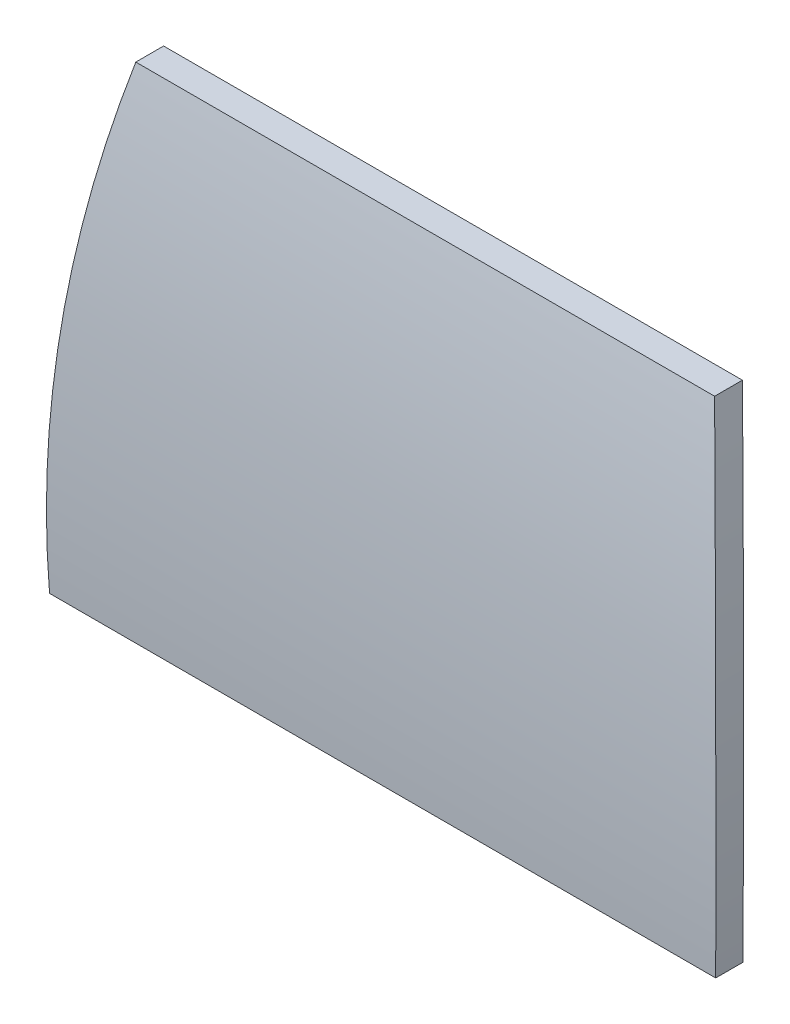
ISO-10303-21;
HEADER;
FILE_DESCRIPTION(('STEP AP214'),'2;1');
FILE_NAME('part.step','',(''),(''),'','','');
FILE_SCHEMA(('AUTOMOTIVE_DESIGN { 1 0 10303 214 1 1 1 1 }'));
ENDSEC;
DATA;
#1=APPLICATION_CONTEXT('core data for automotive mechanical design processes');
#2=APPLICATION_PROTOCOL_DEFINITION('international standard','automotive_design',2000,#1);
#3=PRODUCT_CONTEXT('',#1,'mechanical');
#4=PRODUCT('Part','Part','',(#3));
#5=PRODUCT_RELATED_PRODUCT_CATEGORY('part','',(#4));
#6=PRODUCT_DEFINITION_FORMATION('','',#4);
#7=PRODUCT_DEFINITION_CONTEXT('part definition',#1,'design');
#8=PRODUCT_DEFINITION('design','',#6,#7);
#9=PRODUCT_DEFINITION_SHAPE('','',#8);
#10=(LENGTH_UNIT() NAMED_UNIT(*) SI_UNIT(.MILLI.,.METRE.));
#11=(NAMED_UNIT(*) PLANE_ANGLE_UNIT() SI_UNIT($,.RADIAN.));
#12=(NAMED_UNIT(*) SI_UNIT($,.STERADIAN.) SOLID_ANGLE_UNIT());
#13=UNCERTAINTY_MEASURE_WITH_UNIT(LENGTH_MEASURE(1.E-05),#10,'distance_accuracy_value','');
#14=(GEOMETRIC_REPRESENTATION_CONTEXT(3) GLOBAL_UNCERTAINTY_ASSIGNED_CONTEXT((#13)) GLOBAL_UNIT_ASSIGNED_CONTEXT((#10,
#11,#12)) REPRESENTATION_CONTEXT('',''));
#15=CARTESIAN_POINT('',(0.,0.,0.));
#16=DIRECTION('',(0.,0.,1.));
#17=DIRECTION('',(1.,0.,0.));
#18=AXIS2_PLACEMENT_3D('',#15,#16,#17);
#19=CARTESIAN_POINT('',(124.179493225304,1295.4,254.));
#20=DIRECTION('',(0.,1.,0.));
#21=DIRECTION('',(0.,0.,1.));
#22=AXIS2_PLACEMENT_3D('',#19,#20,#21);
#23=PLANE('',#22);
#24=DIRECTION('',(0.,0.,-1.));
#25=VECTOR('',#24,1.);
#26=CARTESIAN_POINT('',(124.179493225304,1295.4,254.));
#27=LINE('',#26,#25);
#28=CARTESIAN_POINT('',(124.179493225304,1295.4,-118.0703125));
#29=VERTEX_POINT('',#28);
#30=CARTESIAN_POINT('',(124.179493225304,1295.4,-196.186778864413));
#31=VERTEX_POINT('',#30);
#32=EDGE_CURVE('E138',#29,#31,#27,.T.);
#33=ORIENTED_EDGE('',*,*,#32,.F.);
#34=DIRECTION('',(1.,0.,0.));
#35=VECTOR('',#34,1.);
#36=CARTESIAN_POINT('',(-1778.,1295.4,-118.0703125));
#37=LINE('',#36,#35);
#38=CARTESIAN_POINT('',(1749.7794932253,1295.4,-118.0703125));
#39=VERTEX_POINT('',#38);
#40=EDGE_CURVE('E171',#29,#39,#37,.T.);
#41=ORIENTED_EDGE('',*,*,#40,.T.);
#42=DIRECTION('',(0.,0.,-1.));
#43=VECTOR('',#42,1.);
#44=CARTESIAN_POINT('',(1749.7794932253,1295.4,254.));
#45=LINE('',#44,#43);
#46=CARTESIAN_POINT('',(1749.7794932253,1295.4,-196.186778864413));
#47=VERTEX_POINT('',#46);
#48=EDGE_CURVE('E144',#39,#47,#45,.T.);
#49=ORIENTED_EDGE('',*,*,#48,.T.);
#50=DIRECTION('',(1.,0.,0.));
#51=VECTOR('',#50,1.);
#52=CARTESIAN_POINT('',(-1778.,1295.4,-196.186778864413));
#53=LINE('',#52,#51);
#54=EDGE_CURVE('E130',#31,#47,#53,.T.);
#55=ORIENTED_EDGE('',*,*,#54,.F.);
#56=EDGE_LOOP('',(#33,#41,#49,#55));
#57=FACE_BOUND('',#56,.T.);
#58=ADVANCED_FACE('F80',(#57),#23,.T.);
#59=CARTESIAN_POINT('',(4720.11491641945,201.172900249094,254.));
#60=DIRECTION('',(0.,0.,-1.));
#61=DIRECTION('',(-1.,0.,0.));
#62=AXIS2_PLACEMENT_3D('',#59,#60,#61);
#63=CYLINDRICAL_SURFACE('',#62,4724.4);
#64=CARTESIAN_POINT('',(124.179493225305,1295.4,-118.070312500048));
#65=CARTESIAN_POINT('',(121.069812315793,1282.3388308182,-115.086184242106));
#66=CARTESIAN_POINT('',(118.013210171241,1269.25347187329,-112.153150319882));
#67=CARTESIAN_POINT('',(112.007016473262,1243.03556245005,-106.390139647571));
#68=CARTESIAN_POINT('',(109.057425106246,1229.90301188956,-103.560163077006));
#69=CARTESIAN_POINT('',(100.370482184698,1190.43651149152,-95.2261561297446));
#70=CARTESIAN_POINT('',(94.794940919211,1164.03362522618,-89.8780284697998));
#71=CARTESIAN_POINT('',(84.082125290662,1111.05518275444,-79.6043886545862));
#72=CARTESIAN_POINT('',(78.9448865213368,1084.47961271295,-74.6789108217436));
#73=CARTESIAN_POINT('',(69.1156646072195,1031.17044565624,-65.2576254129734));
#74=CARTESIAN_POINT('',(64.4236794882457,1004.43684934225,-60.7618159319658));
#75=CARTESIAN_POINT('',(55.5311674203843,951.065635511124,-52.2444524571049));
#76=CARTESIAN_POINT('',(51.3266052434973,924.429312192683,-48.2190019056469));
#77=CARTESIAN_POINT('',(43.3662119694127,871.027872784341,-40.6016632767679));
#78=CARTESIAN_POINT('',(39.6103811421866,844.262756616963,-37.0097754601925));
#79=CARTESIAN_POINT('',(32.5525268274494,790.618451556057,-30.2646900322868));
#80=CARTESIAN_POINT('',(29.250489524817,763.739266160902,-27.1114790660057));
#81=CARTESIAN_POINT('',(23.1045222474866,709.880441414233,-21.2481018497201));
#82=CARTESIAN_POINT('',(20.2605921858587,682.90080208178,-18.5379355156441));
#83=CARTESIAN_POINT('',(15.034398905281,628.852532188738,-13.5642647929107));
#84=CARTESIAN_POINT('',(12.6521849333601,601.783892448082,-11.3008080502067));
#85=CARTESIAN_POINT('',(9.42790456035769,561.128545223557,-8.24342126149054));
#86=CARTESIAN_POINT('',(8.41131480346189,547.567982118877,-7.28058916455031));
#87=CARTESIAN_POINT('',(6.494779502591,520.430778899539,-5.46782797014183));
#88=CARTESIAN_POINT('',(5.59483643880174,506.854138449229,-4.61790127330107));
#89=CARTESIAN_POINT('',(3.07050541796342,466.103497638401,-2.23801088260977));
#90=CARTESIAN_POINT('',(1.62158063979844,438.908336751173,-0.877903706807279));
#91=CARTESIAN_POINT('',(-0.806253954059922,384.478104333366,1.38722454496585));
#92=CARTESIAN_POINT('',(-1.78516388116343,357.243032812248,2.29224572880794));
#93=CARTESIAN_POINT('',(-2.90338720072489,316.249407973363,3.31051636731869));
#94=CARTESIAN_POINT('',(-3.21838321291887,302.499509826263,3.59389150932875));
#95=CARTESIAN_POINT('',(-3.72829671271741,274.995874371903,4.04435609155903));
#96=CARTESIAN_POINT('',(-3.92321673335173,261.242137151754,4.21144798480991));
#97=CARTESIAN_POINT('',(-4.32775498047067,219.977581652507,4.53818654794127));
#98=CARTESIAN_POINT('',(-4.35715650427478,192.46323215755,4.52330075662259));
#99=CARTESIAN_POINT('',(-3.93531715015976,137.44180841599,4.02803344353027));
#100=CARTESIAN_POINT('',(-3.48406573630233,109.934734342085,3.54764171786227));
#101=CARTESIAN_POINT('',(-2.44725885589918,68.6927403475285,2.47847894224159));
#102=CARTESIAN_POINT('',(-2.04166329678651,54.9483952367969,2.06399048616887));
#103=CARTESIAN_POINT('',(-1.11065453060016,27.4677309929707,1.11898014885806));
#104=CARTESIAN_POINT('',(-0.585241121893294,13.7314118734215,0.588458072355076));
#105=CARTESIAN_POINT('',(-1.17138151591573E-13,1.31505676272261E-13,4.85969091697876E-11));
#106=B_SPLINE_CURVE_WITH_KNOTS('',3,(#64,#65,#66,#67,#68,#69,#70,#71,#72,#73,#74,#75,#76,#77,
#78,#79,#80,#81,#82,#83,#84,#85,#86,#87,#88,#89,#90,#91,#92,#93,#94,#95,#96,#97,#98,#99,#100,
#101,#102,#103,#104,#105),.UNSPECIFIED.,.F.,.F.,(4,2,2,2,2,2,2,2,2,2,2,2,2,2,2,2,2,2,2,2,4),(0.,
41.2611926904615,82.5224572533026,165.044709344237,247.573656549024,330.102237816858,
411.889652190688,493.677115770261,575.462088890868,657.247046492053,739.040722551297,
779.937858143282,820.835863162935,902.630542467087,984.425202383001,1025.69358427508,
1066.96109557164,1149.49555580337,1232.03182523215,1273.30066082635,1314.56956586954),.UNSPECIFIED.);
#107=CARTESIAN_POINT('',(0.,0.,0.));
#108=VERTEX_POINT('',#107);
#109=EDGE_CURVE('E102',#29,#108,#106,.T.);
#110=ORIENTED_EDGE('',*,*,#109,.F.);
#111=ORIENTED_EDGE('',*,*,#32,.T.);
#112=CARTESIAN_POINT('',(124.179493225305,1295.4,-196.186778864414));
#113=CARTESIAN_POINT('',(121.068860263091,1282.33483159595,-193.229171358011));
#114=CARTESIAN_POINT('',(118.011432248345,1269.24585309259,-190.321309967949));
#115=CARTESIAN_POINT('',(112.003813571932,1243.02143908946,-184.605925870522));
#116=CARTESIAN_POINT('',(109.053623089499,1229.88600351208,-181.798403330864));
#117=CARTESIAN_POINT('',(100.365184710962,1190.41191359675,-173.527647522483));
#118=CARTESIAN_POINT('',(94.7890481254546,1164.00538472007,-168.216205375737));
#119=CARTESIAN_POINT('',(84.075653018519,1111.02227275364,-158.00480066179));
#120=CARTESIAN_POINT('',(78.9384287516425,1084.4456765648,-153.104870211189));
#121=CARTESIAN_POINT('',(69.1096429741278,1031.13669791746,-143.723350278077));
#122=CARTESIAN_POINT('',(64.4180795702413,1004.40431612127,-139.241759018385));
#123=CARTESIAN_POINT('',(55.5256719239439,951.031584319315,-130.7403363622));
#124=CARTESIAN_POINT('',(51.3208880259919,924.392480392203,-126.716802941197));
#125=CARTESIAN_POINT('',(43.3603449017789,870.986990445372,-119.092064888095));
#126=CARTESIAN_POINT('',(39.6045859359102,844.220604351852,-115.490860500908));
#127=CARTESIAN_POINT('',(32.5470460066447,790.57489568469,-108.715784370945));
#128=CARTESIAN_POINT('',(29.2452518417907,763.695576418622,-105.541900201602));
#129=CARTESIAN_POINT('',(23.0998519362544,709.837301048887,-99.6257239090019));
#130=CARTESIAN_POINT('',(20.2562461123694,682.858344963315,-96.8834317073717));
#131=CARTESIAN_POINT('',(15.030719833587,628.811990825891,-91.8339793694016));
#132=CARTESIAN_POINT('',(12.6488471107589,601.744583924147,-89.5268642205403));
#133=CARTESIAN_POINT('',(9.42504741972631,561.091126879574,-86.3952907783293));
#134=CARTESIAN_POINT('',(8.4086127698785,547.531201913459,-85.4062799213352));
#135=CARTESIAN_POINT('',(6.49237531760525,520.395253574842,-83.5382565705519));
#136=CARTESIAN_POINT('',(5.59257493485812,506.819229874253,-82.6592463588338));
#137=CARTESIAN_POINT('',(3.06864969197426,466.070336191109,-80.1877423206085));
#138=CARTESIAN_POINT('',(1.61996552936711,438.876199790911,-78.7607408897118));
#139=CARTESIAN_POINT('',(-0.80744512423764,384.447321882289,-76.3501710825335));
#140=CARTESIAN_POINT('',(-1.78617173114655,357.212580383881,-75.3666025968827));
#141=CARTESIAN_POINT('',(-2.90405491041519,316.221648023439,-74.2214832436201));
#142=CARTESIAN_POINT('',(-3.21891147810693,302.47452665056,-73.8941200542088));
#143=CARTESIAN_POINT('',(-3.7285978969424,274.976113185498,-73.3526708067673));
#144=CARTESIAN_POINT('',(-3.92343021784314,261.224821184962,-73.1385824178773));
#145=CARTESIAN_POINT('',(-4.32777075941755,219.967044944319,-72.6663466588179));
#146=CARTESIAN_POINT('',(-4.35712759153224,192.456475968312,-72.5782235411757));
#147=CARTESIAN_POINT('',(-3.93528582885693,137.440708643657,-72.8555090866083));
#148=CARTESIAN_POINT('',(-3.48407671141678,109.9355104258,-73.2209276806293));
#149=CARTESIAN_POINT('',(-2.44730964066491,68.6945906981424,-74.1087257309944));
#150=CARTESIAN_POINT('',(-2.04172348662251,54.9503154945403,-74.4612744772306));
#151=CARTESIAN_POINT('',(-1.11070809764531,27.4691685210984,-75.279449128832));
#152=CARTESIAN_POINT('',(-0.585278662965239,13.7322967636364,-75.7450752226658));
#153=CARTESIAN_POINT('',(-4.24092768705555E-13,4.28265447391173E-13,-76.2671652196317));
#154=B_SPLINE_CURVE_WITH_KNOTS('',3,(#112,#113,#114,#115,#116,#117,#118,#119,#120,#121,#122,
#123,#124,#125,#126,#127,#128,#129,#130,#131,#132,#133,#134,#135,#136,#137,#138,#139,#140,#141,
#142,#143,#144,#145,#146,#147,#148,#149,#150,#151,#152,#153),.UNSPECIFIED.,.F.,.F.,(4,2,2,2,2,2,
2,2,2,2,2,2,2,2,2,2,2,2,2,2,4),(0.,41.256058258685,82.5121854691904,165.024151467941,
247.542551174238,330.060600311689,411.855594391405,493.650635904327,575.443298285157,
657.235945813194,739.037044225087,779.937883458418,820.839571079122,902.641607037728,
984.4436228205,1025.7066209493,1066.96876997482,1149.49251425976,1232.01806555233,
1273.28153150594,1314.54506623473),.UNSPECIFIED.);
#155=CARTESIAN_POINT('',(0.,0.,-76.2671652196312));
#156=VERTEX_POINT('',#155);
#157=EDGE_CURVE('E124',#31,#156,#154,.T.);
#158=ORIENTED_EDGE('',*,*,#157,.T.);
#159=DIRECTION('',(0.,0.,-1.));
#160=VECTOR('',#159,1.);
#161=CARTESIAN_POINT('',(0.,5.55111512312578E-13,254.));
#162=LINE('',#161,#160);
#163=EDGE_CURVE('E136',#108,#156,#162,.T.);
#164=ORIENTED_EDGE('',*,*,#163,.F.);
#165=EDGE_LOOP('',(#110,#111,#158,#164));
#166=FACE_BOUND('',#165,.T.);
#167=ADVANCED_FACE('F135',(#166),#63,.T.);
#168=CARTESIAN_POINT('',(0.,0.,254.));
#169=DIRECTION('',(0.,1.,0.));
#170=DIRECTION('',(0.,0.,1.));
#171=AXIS2_PLACEMENT_3D('',#168,#169,#170);
#172=PLANE('',#171);
#173=DIRECTION('',(1.,0.,0.));
#174=VECTOR('',#173,1.);
#175=CARTESIAN_POINT('',(-1778.,0.,0.));
#176=LINE('',#175,#174);
#177=CARTESIAN_POINT('',(1870.964,0.,0.));
#178=VERTEX_POINT('',#177);
#179=EDGE_CURVE('E98',#108,#178,#176,.T.);
#180=ORIENTED_EDGE('',*,*,#179,.F.);
#181=ORIENTED_EDGE('',*,*,#163,.T.);
#182=DIRECTION('',(1.,0.,0.));
#183=VECTOR('',#182,1.);
#184=CARTESIAN_POINT('',(-1778.,0.,-76.2671652196312));
#185=LINE('',#184,#183);
#186=CARTESIAN_POINT('',(1870.964,0.,-76.2671652196312));
#187=VERTEX_POINT('',#186);
#188=EDGE_CURVE('E120',#156,#187,#185,.T.);
#189=ORIENTED_EDGE('',*,*,#188,.T.);
#190=DIRECTION('',(0.,0.,-1.));
#191=VECTOR('',#190,1.);
#192=CARTESIAN_POINT('',(1870.964,0.,254.));
#193=LINE('',#192,#191);
#194=EDGE_CURVE('E141',#178,#187,#193,.T.);
#195=ORIENTED_EDGE('',*,*,#194,.F.);
#196=EDGE_LOOP('',(#180,#181,#189,#195));
#197=FACE_BOUND('',#196,.T.);
#198=ADVANCED_FACE('F140',(#197),#172,.F.);
#199=CARTESIAN_POINT('',(-2848.68393844922,211.845927721114,254.));
#200=DIRECTION('',(0.,0.,-1.));
#201=DIRECTION('',(-1.,0.,0.));
#202=AXIS2_PLACEMENT_3D('',#199,#200,#201);
#203=CYLINDRICAL_SURFACE('',#202,4724.4);
#204=ORIENTED_EDGE('',*,*,#48,.F.);
#205=CARTESIAN_POINT('',(1749.7794932253,1295.4,-118.070312500048));
#206=CARTESIAN_POINT('',(1752.85810908438,1282.33475906293,-115.085253943212));
#207=CARTESIAN_POINT('',(1755.88362116769,1269.2454388277,-112.151350292436));
#208=CARTESIAN_POINT('',(1761.82758620292,1243.01983181138,-106.386716163662));
#209=CARTESIAN_POINT('',(1764.74603896905,1229.88354494883,-103.555985864718));
#210=CARTESIAN_POINT('',(1773.33949552409,1190.40618087392,-95.2198843694875));
#211=CARTESIAN_POINT('',(1778.85261868934,1163.99651057817,-89.8705820963837));
#212=CARTESIAN_POINT('',(1789.44042465525,1111.00546234909,-79.5949963110039));
#213=CARTESIAN_POINT('',(1794.5150720693,1084.42407074293,-74.6687469408319));
#214=CARTESIAN_POINT('',(1804.21896788451,1031.10424000341,-65.2462737248424));
#215=CARTESIAN_POINT('',(1808.84821825408,1004.36580156466,-60.7500479785473));
#216=CARTESIAN_POINT('',(1817.61569948667,950.985991586951,-52.2321692880596));
#217=CARTESIAN_POINT('',(1821.75796732553,924.345905454949,-48.2066163641626));
#218=CARTESIAN_POINT('',(1829.59368366283,870.93795525266,-40.5893269195782));
#219=CARTESIAN_POINT('',(1833.287131893,844.170091106007,-36.9975906581943));
#220=CARTESIAN_POINT('',(1840.22016404233,790.521324686783,-30.2530127395787));
#221=CARTESIAN_POINT('',(1843.4597617497,763.640425873831,-27.1001577489253));
#222=CARTESIAN_POINT('',(1849.48082209697,709.779228599514,-21.2376463456619));
#223=CARTESIAN_POINT('',(1852.26228482352,682.798930156953,-18.5279898492159));
#224=CARTESIAN_POINT('',(1857.36353793883,628.750444566821,-13.5554437387382));
#225=CARTESIAN_POINT('',(1859.68327965523,601.682248458851,-11.292601225846));
#226=CARTESIAN_POINT('',(1862.81388368032,561.028376664006,-8.23617139467009));
#227=CARTESIAN_POINT('',(1863.7992532158,547.46844033334,-7.27366421816707));
#228=CARTESIAN_POINT('',(1865.65336195554,520.33276164355,-5.4615580196152));
#229=CARTESIAN_POINT('',(1866.52209868068,506.757018954636,-4.61196139756021));
#230=CARTESIAN_POINT('',(1868.95283962131,466.009475036694,-2.23305858419979));
#231=CARTESIAN_POINT('',(1870.33940827496,438.816920830771,-0.873606569941388));
#232=CARTESIAN_POINT('',(1872.64264280264,384.392990977742,1.39027211952501));
#233=CARTESIAN_POINT('',(1873.55930878151,357.1616153393,2.29469889626523));
#234=CARTESIAN_POINT('',(1874.58399801725,316.174344847968,3.31216263380261));
#235=CARTESIAN_POINT('',(1874.86764739968,302.426699933483,3.59528206814687));
#236=CARTESIAN_POINT('',(1875.31491045677,274.927847020845,4.04527120351362));
#237=CARTESIAN_POINT('',(1875.47852666362,261.176639103978,4.21214335684245));
#238=CARTESIAN_POINT('',(1875.78922331132,219.920083806896,4.53828714409945));
#239=CARTESIAN_POINT('',(1875.75615644275,192.411618378837,4.52309073582165));
#240=CARTESIAN_POINT('',(1875.20960376642,137.40307316672,4.02742977640882));
#241=CARTESIAN_POINT('',(1874.69610776405,109.902993572995,3.54695535214759));
#242=CARTESIAN_POINT('',(1873.56613148225,68.672298931584,2.47788067658529));
#243=CARTESIAN_POINT('',(1873.12951213787,54.9318556023691,2.06345697615265));
#244=CARTESIAN_POINT('',(1872.13652561549,27.4592616813093,1.1186536134809));
#245=CARTESIAN_POINT('',(1871.58015823733,13.7271111033642,0.588273757422278));
#246=CARTESIAN_POINT('',(1870.964,1.84083917052033E-12,4.91388023815528E-11));
#247=B_SPLINE_CURVE_WITH_KNOTS('',3,(#205,#206,#207,#208,#209,#210,#211,#212,#213,#214,#215,
#216,#217,#218,#219,#220,#221,#222,#223,#224,#225,#226,#227,#228,#229,#230,#231,#232,#233,#234,
#235,#236,#237,#238,#239,#240,#241,#242,#243,#244,#245,#246),.UNSPECIFIED.,.F.,.F.,(4,2,2,2,2,2,
2,2,2,2,2,2,2,2,2,2,2,2,2,2,4),(0.,41.2524331701597,82.5049379294498,165.009664608232,
247.521043511642,330.032057741409,411.801935881847,493.571862898033,575.339305162553,
657.106731959831,738.88277371862,779.771092315391,820.660279883397,902.437336411593,
984.214374692426,1025.47393819483,1066.73263127556,1149.24945773725,1231.76803523137,
1273.0280205705,1314.2880748758),.UNSPECIFIED.);
#248=EDGE_CURVE('E12',#39,#178,#247,.T.);
#249=ORIENTED_EDGE('',*,*,#248,.T.);
#250=ORIENTED_EDGE('',*,*,#194,.T.);
#251=CARTESIAN_POINT('',(1749.7794932253,1295.4,-196.186778864414));
#252=CARTESIAN_POINT('',(1752.859052612,1282.33075440478,-193.228248379154));
#253=CARTESIAN_POINT('',(1755.88538277876,1269.23780999223,-190.319523641546));
#254=CARTESIAN_POINT('',(1761.83075868174,1243.00569063036,-184.602527062847));
#255=CARTESIAN_POINT('',(1764.74980423931,1229.8665156041,-181.794255389033));
#256=CARTESIAN_POINT('',(1773.34473947349,1190.38155445018,-173.521416251457));
#257=CARTESIAN_POINT('',(1778.85844966696,1163.96823910492,-168.208803578352));
#258=CARTESIAN_POINT('',(1789.44682425119,1110.9725197148,-157.995454955193));
#259=CARTESIAN_POINT('',(1794.5214545839,1084.39010272461,-153.094750956464));
#260=CARTESIAN_POINT('',(1804.22491401353,1031.07046465456,-143.712034217513));
#261=CARTESIAN_POINT('',(1808.85374499823,1004.33324423073,-139.230019704327));
#262=CARTESIAN_POINT('',(1817.62111755045,950.951921036071,-130.728063479914));
#263=CARTESIAN_POINT('',(1821.76360041005,924.30905573803,-126.704416485718));
#264=CARTESIAN_POINT('',(1829.5994567048,870.897058989503,-119.079702720018));
#265=CARTESIAN_POINT('',(1833.29282988116,844.12792746627,-115.478636192012));
#266=CARTESIAN_POINT('',(1840.22554395253,790.477762995185,-108.704038888067));
#267=CARTESIAN_POINT('',(1843.46489802352,763.596733318025,-105.530495705184));
#268=CARTESIAN_POINT('',(1849.48539199879,709.736091216987,-99.6151552090619));
#269=CARTESIAN_POINT('',(1852.26653198601,682.756478810957,-96.8733578176636));
#270=CARTESIAN_POINT('',(1857.36712263572,628.70991218612,-91.8250012109061));
#271=CARTESIAN_POINT('',(1859.68652611113,601.642949327491,-89.5184864804156));
#272=CARTESIAN_POINT('',(1862.81665407727,560.990967680482,-86.3878513476026));
#273=CARTESIAN_POINT('',(1863.80187006796,547.431669371575,-85.3991595398229));
#274=CARTESIAN_POINT('',(1865.65568403585,520.297245104695,-83.531780307388));
#275=CARTESIAN_POINT('',(1866.52427959443,506.722118824347,-82.6530951642348));
#276=CARTESIAN_POINT('',(1868.95461904671,465.976320873426,-80.1825652501953));
#277=CARTESIAN_POINT('',(1870.34094961484,438.78479000304,-78.7562120914521));
#278=CARTESIAN_POINT('',(1872.6437636267,384.362211653849,-76.3468836453649));
#279=CARTESIAN_POINT('',(1873.56024718012,357.13116418427,-75.3639082545139));
#280=CARTESIAN_POINT('',(1874.5846025374,316.146584322109,-74.2195989949638));
#281=CARTESIAN_POINT('',(1874.86811881724,302.401716243312,-73.8924934015264));
#282=CARTESIAN_POINT('',(1875.31516670905,274.908085309448,-73.3515253130295));
#283=CARTESIAN_POINT('',(1875.47870078994,261.159322540347,-73.1376604877858));
#284=CARTESIAN_POINT('',(1875.78921516798,219.909546234984,-72.6660341490046));
#285=CARTESIAN_POINT('',(1875.75611219196,192.404861037538,-72.5782356436453));
#286=CARTESIAN_POINT('',(1875.20956992545,137.401971236835,-72.8559527833964));
#287=CARTESIAN_POINT('',(1874.69612043628,109.903766783576,-73.2214780535031));
#288=CARTESIAN_POINT('',(1873.56618637558,68.6741464712273,-74.1092324184715));
#289=CARTESIAN_POINT('',(1873.1295765902,54.9337732246646,-74.461732626837));
#290=CARTESIAN_POINT('',(1872.13658236996,27.4606974566816,-75.2797357137626));
#291=CARTESIAN_POINT('',(1871.58019773676,13.7279949480013,-75.7452387794468));
#292=CARTESIAN_POINT('',(1870.964,2.19084821801792E-12,-76.2671652196315));
#293=B_SPLINE_CURVE_WITH_KNOTS('',3,(#251,#252,#253,#254,#255,#256,#257,#258,#259,#260,#261,
#262,#263,#264,#265,#266,#267,#268,#269,#270,#271,#272,#273,#274,#275,#276,#277,#278,#279,#280,
#281,#282,#283,#284,#285,#286,#287,#288,#289,#290,#291,#292),.UNSPECIFIED.,.F.,.F.,(4,2,2,2,2,2,
2,2,2,2,2,2,2,2,2,2,2,2,2,2,4),(0.,41.2472944343529,82.4946575521488,164.989089878197,
247.489915316755,329.990391385084,411.767848309121,493.545352354421,575.320482663496,
657.095598168833,738.879066379122,779.771090656549,820.663962880655,902.448379588883,
984.232777204456,1025.48695570919,1066.74028528314,1149.24639320041,1231.75425292207,
1273.0088690093,1314.26355341149),.UNSPECIFIED.);
#294=EDGE_CURVE('E91',#47,#187,#293,.T.);
#295=ORIENTED_EDGE('',*,*,#294,.F.);
#296=EDGE_LOOP('',(#204,#249,#250,#295));
#297=FACE_BOUND('',#296,.T.);
#298=ADVANCED_FACE('F153',(#297),#203,.T.);
#299=CARTESIAN_POINT('',(-1778.,190.178521981645,-5078.48207620329));
#300=DIRECTION('',(1.,0.,0.));
#301=DIRECTION('',(0.,0.,-1.));
#302=AXIS2_PLACEMENT_3D('',#299,#300,#301);
#303=CYLINDRICAL_SURFACE('',#302,5005.82879110846);
#304=ORIENTED_EDGE('',*,*,#54,.T.);
#305=ORIENTED_EDGE('',*,*,#294,.T.);
#306=ORIENTED_EDGE('',*,*,#188,.F.);
#307=ORIENTED_EDGE('',*,*,#157,.F.);
#308=EDGE_LOOP('',(#304,#305,#306,#307));
#309=FACE_BOUND('',#308,.T.);
#310=ADVANCED_FACE('F123',(#309),#303,.F.);
#311=CARTESIAN_POINT('',(-1778.,208.861419048448,-4873.72130154307));
#312=DIRECTION('',(1.,0.,0.));
#313=DIRECTION('',(0.,0.,-1.));
#314=AXIS2_PLACEMENT_3D('',#311,#312,#313);
#315=CYLINDRICAL_SURFACE('',#314,4878.19458585674);
#316=ORIENTED_EDGE('',*,*,#109,.T.);
#317=ORIENTED_EDGE('',*,*,#179,.T.);
#318=ORIENTED_EDGE('',*,*,#248,.F.);
#319=ORIENTED_EDGE('',*,*,#40,.F.);
#320=EDGE_LOOP('',(#316,#317,#318,#319));
#321=FACE_BOUND('',#320,.T.);
#322=ADVANCED_FACE('F159',(#321),#315,.T.);
#323=CLOSED_SHELL('',(#58,#167,#198,#298,#310,#322));
#324=MANIFOLD_SOLID_BREP('B2',#323);
#325=ADVANCED_BREP_SHAPE_REPRESENTATION('',(#18,#324),#14);
#326=SHAPE_DEFINITION_REPRESENTATION(#9,#325);
ENDSEC;
END-ISO-10303-21;
